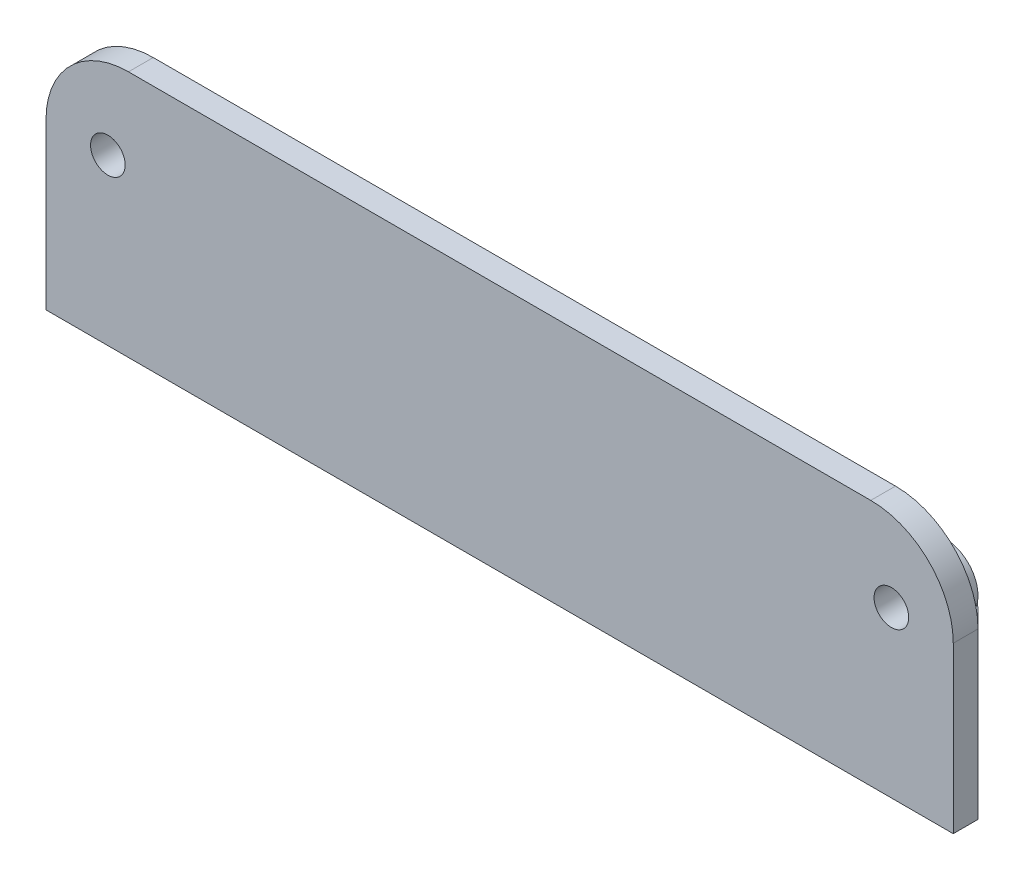
ISO-10303-21;
HEADER;
FILE_DESCRIPTION(('STEP AP214'),'2;1');
FILE_NAME('part.step','',(''),(''),'','','');
FILE_SCHEMA(('AUTOMOTIVE_DESIGN { 1 0 10303 214 1 1 1 1 }'));
ENDSEC;
DATA;
#1=APPLICATION_CONTEXT('core data for automotive mechanical design processes');
#2=APPLICATION_PROTOCOL_DEFINITION('international standard','automotive_design',2000,#1);
#3=PRODUCT_CONTEXT('',#1,'mechanical');
#4=PRODUCT('Part','Part','',(#3));
#5=PRODUCT_RELATED_PRODUCT_CATEGORY('part','',(#4));
#6=PRODUCT_DEFINITION_FORMATION('','',#4);
#7=PRODUCT_DEFINITION_CONTEXT('part definition',#1,'design');
#8=PRODUCT_DEFINITION('design','',#6,#7);
#9=PRODUCT_DEFINITION_SHAPE('','',#8);
#10=(LENGTH_UNIT() NAMED_UNIT(*) SI_UNIT(.MILLI.,.METRE.));
#11=(NAMED_UNIT(*) PLANE_ANGLE_UNIT() SI_UNIT($,.RADIAN.));
#12=(NAMED_UNIT(*) SI_UNIT($,.STERADIAN.) SOLID_ANGLE_UNIT());
#13=UNCERTAINTY_MEASURE_WITH_UNIT(LENGTH_MEASURE(1.E-05),#10,'distance_accuracy_value','');
#14=(GEOMETRIC_REPRESENTATION_CONTEXT(3) GLOBAL_UNCERTAINTY_ASSIGNED_CONTEXT((#13)) GLOBAL_UNIT_ASSIGNED_CONTEXT((#10,
#11,#12)) REPRESENTATION_CONTEXT('',''));
#15=CARTESIAN_POINT('',(0.,0.,0.));
#16=DIRECTION('',(0.,0.,1.));
#17=DIRECTION('',(1.,0.,0.));
#18=AXIS2_PLACEMENT_3D('',#15,#16,#17);
#19=CARTESIAN_POINT('',(0.,0.,15.));
#20=DIRECTION('',(0.,0.,-1.));
#21=DIRECTION('',(-1.,0.,0.));
#22=AXIS2_PLACEMENT_3D('',#19,#20,#21);
#23=PLANE('',#22);
#24=DIRECTION('',(-1.,0.,0.));
#25=VECTOR('',#24,1.);
#26=CARTESIAN_POINT('',(-55.,30.,15.));
#27=LINE('',#26,#25);
#28=CARTESIAN_POINT('',(-38.,30.,15.));
#29=VERTEX_POINT('',#28);
#30=CARTESIAN_POINT('',(-45.,30.,15.));
#31=VERTEX_POINT('',#30);
#32=EDGE_CURVE('E273',#29,#31,#27,.T.);
#33=ORIENTED_EDGE('',*,*,#32,.F.);
#34=DIRECTION('',(0.,-1.,0.));
#35=VECTOR('',#34,1.);
#36=CARTESIAN_POINT('',(-38.,5.,15.));
#37=LINE('',#36,#35);
#38=CARTESIAN_POINT('',(-38.,5.,15.));
#39=VERTEX_POINT('',#38);
#40=EDGE_CURVE('E399',#29,#39,#37,.T.);
#41=ORIENTED_EDGE('',*,*,#40,.T.);
#42=DIRECTION('',(1.,0.,0.));
#43=VECTOR('',#42,1.);
#44=CARTESIAN_POINT('',(55.,5.,15.));
#45=LINE('',#44,#43);
#46=CARTESIAN_POINT('',(-55.,5.,15.));
#47=VERTEX_POINT('',#46);
#48=EDGE_CURVE('E281',#47,#39,#45,.T.);
#49=ORIENTED_EDGE('',*,*,#48,.F.);
#50=DIRECTION('',(0.,-1.,0.));
#51=VECTOR('',#50,1.);
#52=CARTESIAN_POINT('',(-55.,0.,15.));
#53=LINE('',#52,#51);
#54=CARTESIAN_POINT('',(-55.,20.,15.));
#55=VERTEX_POINT('',#54);
#56=EDGE_CURVE('E253',#55,#47,#53,.T.);
#57=ORIENTED_EDGE('',*,*,#56,.F.);
#58=CARTESIAN_POINT('',(-45.,20.,15.));
#59=DIRECTION('',(0.,0.,-1.));
#60=DIRECTION('',(-1.,0.,0.));
#61=AXIS2_PLACEMENT_3D('',#58,#59,#60);
#62=CIRCLE('',#61,10.);
#63=EDGE_CURVE('E294',#55,#31,#62,.T.);
#64=ORIENTED_EDGE('',*,*,#63,.T.);
#65=EDGE_LOOP('',(#33,#41,#49,#57,#64));
#66=FACE_BOUND('',#65,.T.);
#67=CARTESIAN_POINT('',(-47.5,20.,15.));
#68=DIRECTION('',(0.,0.,-1.));
#69=DIRECTION('',(1.,0.,0.));
#70=AXIS2_PLACEMENT_3D('',#67,#68,#69);
#71=CIRCLE('',#70,4.00000000000001);
#72=CARTESIAN_POINT('',(-43.5,20.,15.));
#73=VERTEX_POINT('',#72);
#74=EDGE_CURVE('E456',#73,#73,#71,.T.);
#75=ORIENTED_EDGE('',*,*,#74,.F.);
#76=EDGE_LOOP('',(#75));
#77=FACE_BOUND('',#76,.T.);
#78=ADVANCED_FACE('F35',(#66,#77),#23,.T.);
#79=DIRECTION('',(0.,-1.,0.));
#80=VECTOR('',#79,1.);
#81=CARTESIAN_POINT('',(38.,5.,15.));
#82=LINE('',#81,#80);
#83=CARTESIAN_POINT('',(38.,30.,15.));
#84=VERTEX_POINT('',#83);
#85=CARTESIAN_POINT('',(38.,5.,15.));
#86=VERTEX_POINT('',#85);
#87=EDGE_CURVE('E245',#84,#86,#82,.T.);
#88=ORIENTED_EDGE('',*,*,#87,.F.);
#89=CARTESIAN_POINT('',(45.,30.,15.));
#90=VERTEX_POINT('',#89);
#91=EDGE_CURVE('E258',#90,#84,#27,.T.);
#92=ORIENTED_EDGE('',*,*,#91,.F.);
#93=CARTESIAN_POINT('',(45.,20.,15.));
#94=DIRECTION('',(0.,0.,-1.));
#95=DIRECTION('',(-1.,0.,0.));
#96=AXIS2_PLACEMENT_3D('',#93,#94,#95);
#97=CIRCLE('',#96,10.);
#98=CARTESIAN_POINT('',(55.,20.,15.));
#99=VERTEX_POINT('',#98);
#100=EDGE_CURVE('E292',#90,#99,#97,.T.);
#101=ORIENTED_EDGE('',*,*,#100,.T.);
#102=DIRECTION('',(0.,1.,0.));
#103=VECTOR('',#102,1.);
#104=CARTESIAN_POINT('',(55.,0.,15.));
#105=LINE('',#104,#103);
#106=CARTESIAN_POINT('',(55.,5.,15.));
#107=VERTEX_POINT('',#106);
#108=EDGE_CURVE('E270',#107,#99,#105,.T.);
#109=ORIENTED_EDGE('',*,*,#108,.F.);
#110=EDGE_CURVE('E285',#86,#107,#45,.T.);
#111=ORIENTED_EDGE('',*,*,#110,.F.);
#112=EDGE_LOOP('',(#88,#92,#101,#109,#111));
#113=FACE_BOUND('',#112,.T.);
#114=CARTESIAN_POINT('',(47.5,20.,15.));
#115=DIRECTION('',(0.,0.,-1.));
#116=DIRECTION('',(-1.,0.,0.));
#117=AXIS2_PLACEMENT_3D('',#114,#115,#116);
#118=CIRCLE('',#117,4.00000000000001);
#119=CARTESIAN_POINT('',(43.5,20.,15.));
#120=VERTEX_POINT('',#119);
#121=EDGE_CURVE('E447',#120,#120,#118,.T.);
#122=ORIENTED_EDGE('',*,*,#121,.F.);
#123=EDGE_LOOP('',(#122));
#124=FACE_BOUND('',#123,.T.);
#125=ADVANCED_FACE('F473',(#113,#124),#23,.T.);
#126=CARTESIAN_POINT('',(-38.,30.,15.));
#127=DIRECTION('',(0.,0.514495755427527,-0.857492925712544));
#128=DIRECTION('',(0.,0.857492925712544,0.514495755427527));
#129=AXIS2_PLACEMENT_3D('',#126,#127,#128);
#130=PLANE('',#129);
#131=DIRECTION('',(1.,0.,0.));
#132=VECTOR('',#131,1.);
#133=CARTESIAN_POINT('',(-38.,30.,15.));
#134=LINE('',#133,#132);
#135=CARTESIAN_POINT('',(6.,30.,15.));
#136=VERTEX_POINT('',#135);
#137=CARTESIAN_POINT('',(14.,30.,15.));
#138=VERTEX_POINT('',#137);
#139=EDGE_CURVE('E219',#136,#138,#134,.T.);
#140=ORIENTED_EDGE('',*,*,#139,.T.);
#141=DIRECTION('',(0.,-0.857492925712544,-0.514495755427527));
#142=VECTOR('',#141,1.);
#143=CARTESIAN_POINT('',(14.,30.,15.));
#144=LINE('',#143,#142);
#145=CARTESIAN_POINT('',(14.,5.,0.));
#146=VERTEX_POINT('',#145);
#147=EDGE_CURVE('E190',#138,#146,#144,.T.);
#148=ORIENTED_EDGE('',*,*,#147,.T.);
#149=DIRECTION('',(1.,0.,0.));
#150=VECTOR('',#149,1.);
#151=CARTESIAN_POINT('',(-38.,5.,0.));
#152=LINE('',#151,#150);
#153=CARTESIAN_POINT('',(6.,5.,0.));
#154=VERTEX_POINT('',#153);
#155=EDGE_CURVE('E485',#154,#146,#152,.T.);
#156=ORIENTED_EDGE('',*,*,#155,.F.);
#157=DIRECTION('',(0.,0.857492925712544,0.514495755427527));
#158=VECTOR('',#157,1.);
#159=CARTESIAN_POINT('',(6.,30.,15.));
#160=LINE('',#159,#158);
#161=EDGE_CURVE('E226',#154,#136,#160,.T.);
#162=ORIENTED_EDGE('',*,*,#161,.T.);
#163=EDGE_LOOP('',(#140,#148,#156,#162));
#164=FACE_BOUND('',#163,.T.);
#165=ADVANCED_FACE('F224',(#164),#130,.T.);
#166=CARTESIAN_POINT('',(26.,5.,0.));
#167=VERTEX_POINT('',#166);
#168=CARTESIAN_POINT('',(38.,5.,0.));
#169=VERTEX_POINT('',#168);
#170=EDGE_CURVE('E241',#167,#169,#152,.T.);
#171=ORIENTED_EDGE('',*,*,#170,.F.);
#172=DIRECTION('',(0.,0.857492925712544,0.514495755427527));
#173=VECTOR('',#172,1.);
#174=CARTESIAN_POINT('',(26.,30.,15.));
#175=LINE('',#174,#173);
#176=CARTESIAN_POINT('',(26.,30.,15.));
#177=VERTEX_POINT('',#176);
#178=EDGE_CURVE('E201',#167,#177,#175,.T.);
#179=ORIENTED_EDGE('',*,*,#178,.T.);
#180=EDGE_CURVE('E220',#177,#84,#134,.T.);
#181=ORIENTED_EDGE('',*,*,#180,.T.);
#182=DIRECTION('',(0.,0.857492925712544,0.514495755427527));
#183=VECTOR('',#182,1.);
#184=CARTESIAN_POINT('',(38.,30.,15.));
#185=LINE('',#184,#183);
#186=EDGE_CURVE('E404',#169,#84,#185,.T.);
#187=ORIENTED_EDGE('',*,*,#186,.F.);
#188=EDGE_LOOP('',(#171,#179,#181,#187));
#189=FACE_BOUND('',#188,.T.);
#190=ADVANCED_FACE('F480',(#189),#130,.T.);
#191=CARTESIAN_POINT('',(-14.,30.,15.));
#192=VERTEX_POINT('',#191);
#193=CARTESIAN_POINT('',(-6.,30.,15.));
#194=VERTEX_POINT('',#193);
#195=EDGE_CURVE('E227',#192,#194,#134,.T.);
#196=ORIENTED_EDGE('',*,*,#195,.T.);
#197=DIRECTION('',(0.,-0.857492925712544,-0.514495755427527));
#198=VECTOR('',#197,1.);
#199=CARTESIAN_POINT('',(-6.,30.,15.));
#200=LINE('',#199,#198);
#201=CARTESIAN_POINT('',(-6.,5.,0.));
#202=VERTEX_POINT('',#201);
#203=EDGE_CURVE('E330',#194,#202,#200,.T.);
#204=ORIENTED_EDGE('',*,*,#203,.T.);
#205=CARTESIAN_POINT('',(-14.,5.,0.));
#206=VERTEX_POINT('',#205);
#207=EDGE_CURVE('E240',#206,#202,#152,.T.);
#208=ORIENTED_EDGE('',*,*,#207,.F.);
#209=DIRECTION('',(0.,0.857492925712544,0.514495755427527));
#210=VECTOR('',#209,1.);
#211=CARTESIAN_POINT('',(-14.,30.,15.));
#212=LINE('',#211,#210);
#213=EDGE_CURVE('E323',#206,#192,#212,.T.);
#214=ORIENTED_EDGE('',*,*,#213,.T.);
#215=EDGE_LOOP('',(#196,#204,#208,#214));
#216=FACE_BOUND('',#215,.T.);
#217=ADVANCED_FACE('F492',(#216),#130,.T.);
#218=CARTESIAN_POINT('',(-26.,30.,15.));
#219=VERTEX_POINT('',#218);
#220=EDGE_CURVE('E230',#29,#219,#134,.T.);
#221=ORIENTED_EDGE('',*,*,#220,.T.);
#222=DIRECTION('',(0.,-0.857492925712544,-0.514495755427527));
#223=VECTOR('',#222,1.);
#224=CARTESIAN_POINT('',(-26.,30.,15.));
#225=LINE('',#224,#223);
#226=CARTESIAN_POINT('',(-26.,5.,0.));
#227=VERTEX_POINT('',#226);
#228=EDGE_CURVE('E326',#219,#227,#225,.T.);
#229=ORIENTED_EDGE('',*,*,#228,.T.);
#230=CARTESIAN_POINT('',(-38.,5.,0.));
#231=VERTEX_POINT('',#230);
#232=EDGE_CURVE('E231',#231,#227,#152,.T.);
#233=ORIENTED_EDGE('',*,*,#232,.F.);
#234=DIRECTION('',(0.,0.857492925712544,0.514495755427527));
#235=VECTOR('',#234,1.);
#236=CARTESIAN_POINT('',(-38.,30.,15.));
#237=LINE('',#236,#235);
#238=EDGE_CURVE('E236',#231,#29,#237,.T.);
#239=ORIENTED_EDGE('',*,*,#238,.T.);
#240=EDGE_LOOP('',(#221,#229,#233,#239));
#241=FACE_BOUND('',#240,.T.);
#242=ADVANCED_FACE('F505',(#241),#130,.T.);
#243=CARTESIAN_POINT('',(0.,5.,0.));
#244=DIRECTION('',(0.,1.,0.));
#245=DIRECTION('',(0.,0.,1.));
#246=AXIS2_PLACEMENT_3D('',#243,#244,#245);
#247=PLANE('',#246);
#248=DIRECTION('',(1.,0.,0.));
#249=VECTOR('',#248,1.);
#250=CARTESIAN_POINT('',(57.284508289482,5.,-5.00000000000001));
#251=LINE('',#250,#249);
#252=CARTESIAN_POINT('',(-30.857864376269,5.,-5.));
#253=VERTEX_POINT('',#252);
#254=CARTESIAN_POINT('',(30.857864376269,5.,-5.00000000000001));
#255=VERTEX_POINT('',#254);
#256=EDGE_CURVE('E359',#253,#255,#251,.T.);
#257=ORIENTED_EDGE('',*,*,#256,.F.);
#258=CARTESIAN_POINT('',(-30.857864376269,5.,5.));
#259=DIRECTION('',(0.,1.,0.));
#260=DIRECTION('',(0.,0.,1.));
#261=AXIS2_PLACEMENT_3D('',#258,#259,#260);
#262=CIRCLE('',#261,10.);
#263=CARTESIAN_POINT('',(-37.9289321881345,5.,-2.07106781186548));
#264=VERTEX_POINT('',#263);
#265=EDGE_CURVE('E342',#253,#264,#262,.T.);
#266=ORIENTED_EDGE('',*,*,#265,.T.);
#267=DIRECTION('',(0.707106781186549,0.,-0.707106781186546));
#268=VECTOR('',#267,1.);
#269=CARTESIAN_POINT('',(-19.9999999999999,5.,-20.));
#270=LINE('',#269,#268);
#271=EDGE_CURVE('E318',#264,#47,#270,.F.);
#272=ORIENTED_EDGE('',*,*,#271,.T.);
#273=ORIENTED_EDGE('',*,*,#48,.T.);
#274=DIRECTION('',(0.,0.,-1.));
#275=VECTOR('',#274,1.);
#276=CARTESIAN_POINT('',(-38.,5.,0.));
#277=LINE('',#276,#275);
#278=EDGE_CURVE('E401',#39,#231,#277,.T.);
#279=ORIENTED_EDGE('',*,*,#278,.T.);
#280=ORIENTED_EDGE('',*,*,#232,.T.);
#281=DIRECTION('',(0.,0.,1.));
#282=VECTOR('',#281,1.);
#283=CARTESIAN_POINT('',(-26.,5.,0.));
#284=LINE('',#283,#282);
#285=CARTESIAN_POINT('',(-26.,5.,15.));
#286=VERTEX_POINT('',#285);
#287=EDGE_CURVE('E425',#227,#286,#284,.T.);
#288=ORIENTED_EDGE('',*,*,#287,.T.);
#289=DIRECTION('',(1.,0.,0.));
#290=VECTOR('',#289,1.);
#291=CARTESIAN_POINT('',(-14.,5.,15.));
#292=LINE('',#291,#290);
#293=CARTESIAN_POINT('',(-14.,5.,15.));
#294=VERTEX_POINT('',#293);
#295=EDGE_CURVE('E423',#286,#294,#292,.T.);
#296=ORIENTED_EDGE('',*,*,#295,.T.);
#297=DIRECTION('',(0.,0.,-1.));
#298=VECTOR('',#297,1.);
#299=CARTESIAN_POINT('',(-14.,5.,0.));
#300=LINE('',#299,#298);
#301=EDGE_CURVE('E421',#294,#206,#300,.T.);
#302=ORIENTED_EDGE('',*,*,#301,.T.);
#303=ORIENTED_EDGE('',*,*,#207,.T.);
#304=DIRECTION('',(0.,0.,1.));
#305=VECTOR('',#304,1.);
#306=CARTESIAN_POINT('',(-6.,5.,0.));
#307=LINE('',#306,#305);
#308=CARTESIAN_POINT('',(-6.,5.,15.));
#309=VERTEX_POINT('',#308);
#310=EDGE_CURVE('E416',#202,#309,#307,.T.);
#311=ORIENTED_EDGE('',*,*,#310,.T.);
#312=DIRECTION('',(1.,0.,0.));
#313=VECTOR('',#312,1.);
#314=CARTESIAN_POINT('',(-6.,5.,15.));
#315=LINE('',#314,#313);
#316=CARTESIAN_POINT('',(6.,5.,15.));
#317=VERTEX_POINT('',#316);
#318=EDGE_CURVE('E438',#309,#317,#315,.T.);
#319=ORIENTED_EDGE('',*,*,#318,.T.);
#320=DIRECTION('',(0.,0.,-1.));
#321=VECTOR('',#320,1.);
#322=CARTESIAN_POINT('',(6.,5.,0.));
#323=LINE('',#322,#321);
#324=EDGE_CURVE('E436',#317,#154,#323,.T.);
#325=ORIENTED_EDGE('',*,*,#324,.T.);
#326=ORIENTED_EDGE('',*,*,#155,.T.);
#327=DIRECTION('',(0.,0.,1.));
#328=VECTOR('',#327,1.);
#329=CARTESIAN_POINT('',(14.,5.,0.));
#330=LINE('',#329,#328);
#331=CARTESIAN_POINT('',(14.,5.,15.));
#332=VERTEX_POINT('',#331);
#333=EDGE_CURVE('E195',#146,#332,#330,.T.);
#334=ORIENTED_EDGE('',*,*,#333,.T.);
#335=DIRECTION('',(1.,0.,0.));
#336=VECTOR('',#335,1.);
#337=CARTESIAN_POINT('',(14.,5.,15.));
#338=LINE('',#337,#336);
#339=CARTESIAN_POINT('',(26.,5.,15.));
#340=VERTEX_POINT('',#339);
#341=EDGE_CURVE('E209',#332,#340,#338,.T.);
#342=ORIENTED_EDGE('',*,*,#341,.T.);
#343=DIRECTION('',(0.,0.,-1.));
#344=VECTOR('',#343,1.);
#345=CARTESIAN_POINT('',(26.,5.,0.));
#346=LINE('',#345,#344);
#347=EDGE_CURVE('E221',#340,#167,#346,.T.);
#348=ORIENTED_EDGE('',*,*,#347,.T.);
#349=ORIENTED_EDGE('',*,*,#170,.T.);
#350=DIRECTION('',(0.,0.,-1.));
#351=VECTOR('',#350,1.);
#352=CARTESIAN_POINT('',(38.,5.,0.));
#353=LINE('',#352,#351);
#354=EDGE_CURVE('E409',#86,#169,#353,.T.);
#355=ORIENTED_EDGE('',*,*,#354,.F.);
#356=ORIENTED_EDGE('',*,*,#110,.T.);
#357=DIRECTION('',(0.707106781186548,0.,0.707106781186547));
#358=VECTOR('',#357,1.);
#359=CARTESIAN_POINT('',(20.,5.,-20.));
#360=LINE('',#359,#358);
#361=CARTESIAN_POINT('',(37.9289321881345,5.,-2.07106781186548));
#362=VERTEX_POINT('',#361);
#363=EDGE_CURVE('E315',#107,#362,#360,.F.);
#364=ORIENTED_EDGE('',*,*,#363,.T.);
#365=CARTESIAN_POINT('',(30.857864376269,5.,4.99999999999999));
#366=DIRECTION('',(0.,1.,0.));
#367=DIRECTION('',(0.,0.,1.));
#368=AXIS2_PLACEMENT_3D('',#365,#366,#367);
#369=CIRCLE('',#368,10.);
#370=EDGE_CURVE('E340',#362,#255,#369,.T.);
#371=ORIENTED_EDGE('',*,*,#370,.T.);
#372=EDGE_LOOP('',(#257,#266,#272,#273,#279,#280,#288,#296,#302,#303,#311,#319,#325,#326,#334,
#342,#348,#349,#355,#356,#364,#371));
#373=FACE_BOUND('',#372,.T.);
#374=CARTESIAN_POINT('',(-20.,5.,6.));
#375=DIRECTION('',(0.,-1.,0.));
#376=DIRECTION('',(0.,0.,-1.));
#377=AXIS2_PLACEMENT_3D('',#374,#375,#376);
#378=CIRCLE('',#377,2.25);
#379=CARTESIAN_POINT('',(-20.,5.,3.75));
#380=VERTEX_POINT('',#379);
#381=EDGE_CURVE('E210',#380,#380,#378,.T.);
#382=ORIENTED_EDGE('',*,*,#381,.T.);
#383=EDGE_LOOP('',(#382));
#384=FACE_BOUND('',#383,.T.);
#385=CARTESIAN_POINT('',(20.,5.,6.));
#386=DIRECTION('',(0.,-1.,0.));
#387=DIRECTION('',(0.,0.,-1.));
#388=AXIS2_PLACEMENT_3D('',#385,#386,#387);
#389=CIRCLE('',#388,2.25);
#390=CARTESIAN_POINT('',(20.,5.,3.75));
#391=VERTEX_POINT('',#390);
#392=EDGE_CURVE('E242',#391,#391,#389,.T.);
#393=ORIENTED_EDGE('',*,*,#392,.T.);
#394=EDGE_LOOP('',(#393));
#395=FACE_BOUND('',#394,.T.);
#396=ADVANCED_FACE('F363',(#373,#384,#395),#247,.T.);
#397=CARTESIAN_POINT('',(0.,0.,0.));
#398=DIRECTION('',(0.,1.,0.));
#399=DIRECTION('',(0.,0.,1.));
#400=AXIS2_PLACEMENT_3D('',#397,#398,#399);
#401=PLANE('',#400);
#402=DIRECTION('',(-0.707106781186549,0.,0.707106781186546));
#403=VECTOR('',#402,1.);
#404=CARTESIAN_POINT('',(-55.,0.,15.));
#405=LINE('',#404,#403);
#406=CARTESIAN_POINT('',(-55.,0.,15.));
#407=VERTEX_POINT('',#406);
#408=CARTESIAN_POINT('',(-37.9289321881345,0.,-2.07106781186548));
#409=VERTEX_POINT('',#408);
#410=EDGE_CURVE('E313',#407,#409,#405,.F.);
#411=ORIENTED_EDGE('',*,*,#410,.T.);
#412=CARTESIAN_POINT('',(-30.857864376269,0.,5.));
#413=DIRECTION('',(0.,1.,0.));
#414=DIRECTION('',(0.,0.,1.));
#415=AXIS2_PLACEMENT_3D('',#412,#413,#414);
#416=CIRCLE('',#415,10.);
#417=CARTESIAN_POINT('',(-30.857864376269,0.,-5.));
#418=VERTEX_POINT('',#417);
#419=EDGE_CURVE('E43',#409,#418,#416,.F.);
#420=ORIENTED_EDGE('',*,*,#419,.T.);
#421=DIRECTION('',(1.,0.,0.));
#422=VECTOR('',#421,1.);
#423=CARTESIAN_POINT('',(57.284508289482,0.,-5.00000000000001));
#424=LINE('',#423,#422);
#425=CARTESIAN_POINT('',(30.857864376269,0.,-5.00000000000001));
#426=VERTEX_POINT('',#425);
#427=EDGE_CURVE('E349',#418,#426,#424,.T.);
#428=ORIENTED_EDGE('',*,*,#427,.T.);
#429=CARTESIAN_POINT('',(30.857864376269,0.,4.99999999999999));
#430=DIRECTION('',(0.,1.,0.));
#431=DIRECTION('',(0.,0.,1.));
#432=AXIS2_PLACEMENT_3D('',#429,#430,#431);
#433=CIRCLE('',#432,10.);
#434=CARTESIAN_POINT('',(37.9289321881345,0.,-2.07106781186548));
#435=VERTEX_POINT('',#434);
#436=EDGE_CURVE('E50',#426,#435,#433,.F.);
#437=ORIENTED_EDGE('',*,*,#436,.T.);
#438=DIRECTION('',(-0.707106781186548,0.,-0.707106781186547));
#439=VECTOR('',#438,1.);
#440=CARTESIAN_POINT('',(25.,0.,-15.));
#441=LINE('',#440,#439);
#442=CARTESIAN_POINT('',(55.,0.,15.));
#443=VERTEX_POINT('',#442);
#444=EDGE_CURVE('E311',#435,#443,#441,.F.);
#445=ORIENTED_EDGE('',*,*,#444,.T.);
#446=DIRECTION('',(0.,0.,-1.));
#447=VECTOR('',#446,1.);
#448=CARTESIAN_POINT('',(55.,0.,15.));
#449=LINE('',#448,#447);
#450=CARTESIAN_POINT('',(55.,0.,18.));
#451=VERTEX_POINT('',#450);
#452=EDGE_CURVE('E287',#451,#443,#449,.T.);
#453=ORIENTED_EDGE('',*,*,#452,.F.);
#454=DIRECTION('',(1.,0.,0.));
#455=VECTOR('',#454,1.);
#456=CARTESIAN_POINT('',(-55.,0.,18.));
#457=LINE('',#456,#455);
#458=CARTESIAN_POINT('',(-55.,0.,18.));
#459=VERTEX_POINT('',#458);
#460=EDGE_CURVE('E257',#459,#451,#457,.T.);
#461=ORIENTED_EDGE('',*,*,#460,.F.);
#462=DIRECTION('',(0.,0.,1.));
#463=VECTOR('',#462,1.);
#464=CARTESIAN_POINT('',(-55.,0.,15.));
#465=LINE('',#464,#463);
#466=EDGE_CURVE('E280',#407,#459,#465,.T.);
#467=ORIENTED_EDGE('',*,*,#466,.F.);
#468=EDGE_LOOP('',(#411,#420,#428,#437,#445,#453,#461,#467));
#469=FACE_BOUND('',#468,.T.);
#470=CARTESIAN_POINT('',(-20.,0.,6.));
#471=DIRECTION('',(0.,1.,0.));
#472=DIRECTION('',(0.,0.,1.));
#473=AXIS2_PLACEMENT_3D('',#470,#471,#472);
#474=CIRCLE('',#473,2.25);
#475=CARTESIAN_POINT('',(-20.,0.,8.25000000000001));
#476=VERTEX_POINT('',#475);
#477=EDGE_CURVE('E277',#476,#476,#474,.T.);
#478=ORIENTED_EDGE('',*,*,#477,.T.);
#479=EDGE_LOOP('',(#478));
#480=FACE_BOUND('',#479,.T.);
#481=CARTESIAN_POINT('',(20.,0.,6.));
#482=DIRECTION('',(0.,1.,0.));
#483=DIRECTION('',(0.,0.,-1.));
#484=AXIS2_PLACEMENT_3D('',#481,#482,#483);
#485=CIRCLE('',#484,2.25);
#486=CARTESIAN_POINT('',(20.,0.,3.75));
#487=VERTEX_POINT('',#486);
#488=EDGE_CURVE('E267',#487,#487,#485,.T.);
#489=ORIENTED_EDGE('',*,*,#488,.T.);
#490=EDGE_LOOP('',(#489));
#491=FACE_BOUND('',#490,.T.);
#492=ADVANCED_FACE('F347',(#469,#480,#491),#401,.F.);
#493=CARTESIAN_POINT('',(-55.,5.,15.));
#494=DIRECTION('',(1.,0.,0.));
#495=DIRECTION('',(0.,0.,-1.));
#496=AXIS2_PLACEMENT_3D('',#493,#494,#495);
#497=PLANE('',#496);
#498=ORIENTED_EDGE('',*,*,#56,.T.);
#499=DIRECTION('',(0.,-1.,0.));
#500=VECTOR('',#499,1.);
#501=CARTESIAN_POINT('',(-55.,5.,15.));
#502=LINE('',#501,#500);
#503=EDGE_CURVE('E308',#47,#407,#502,.T.);
#504=ORIENTED_EDGE('',*,*,#503,.T.);
#505=ORIENTED_EDGE('',*,*,#466,.T.);
#506=DIRECTION('',(0.,-1.,0.));
#507=VECTOR('',#506,1.);
#508=CARTESIAN_POINT('',(-55.,0.,18.));
#509=LINE('',#508,#507);
#510=CARTESIAN_POINT('',(-55.,20.,18.));
#511=VERTEX_POINT('',#510);
#512=EDGE_CURVE('E254',#511,#459,#509,.T.);
#513=ORIENTED_EDGE('',*,*,#512,.F.);
#514=DIRECTION('',(0.,0.,-1.));
#515=VECTOR('',#514,1.);
#516=CARTESIAN_POINT('',(-55.,20.,15.));
#517=LINE('',#516,#515);
#518=EDGE_CURVE('E284',#511,#55,#517,.T.);
#519=ORIENTED_EDGE('',*,*,#518,.T.);
#520=EDGE_LOOP('',(#498,#504,#505,#513,#519));
#521=FACE_BOUND('',#520,.T.);
#522=ADVANCED_FACE('F368',(#521),#497,.F.);
#523=CARTESIAN_POINT('',(55.,5.,15.));
#524=DIRECTION('',(-1.,0.,0.));
#525=DIRECTION('',(0.,0.,1.));
#526=AXIS2_PLACEMENT_3D('',#523,#524,#525);
#527=PLANE('',#526);
#528=ORIENTED_EDGE('',*,*,#452,.T.);
#529=DIRECTION('',(0.,1.,0.));
#530=VECTOR('',#529,1.);
#531=CARTESIAN_POINT('',(55.,5.,15.));
#532=LINE('',#531,#530);
#533=EDGE_CURVE('E320',#443,#107,#532,.T.);
#534=ORIENTED_EDGE('',*,*,#533,.T.);
#535=ORIENTED_EDGE('',*,*,#108,.T.);
#536=DIRECTION('',(0.,0.,-1.));
#537=VECTOR('',#536,1.);
#538=CARTESIAN_POINT('',(55.,20.,15.));
#539=LINE('',#538,#537);
#540=CARTESIAN_POINT('',(55.,20.,18.));
#541=VERTEX_POINT('',#540);
#542=EDGE_CURVE('E306',#99,#541,#539,.F.);
#543=ORIENTED_EDGE('',*,*,#542,.T.);
#544=DIRECTION('',(0.,1.,0.));
#545=VECTOR('',#544,1.);
#546=CARTESIAN_POINT('',(55.,0.,18.));
#547=LINE('',#546,#545);
#548=EDGE_CURVE('E261',#451,#541,#547,.T.);
#549=ORIENTED_EDGE('',*,*,#548,.F.);
#550=EDGE_LOOP('',(#528,#534,#535,#543,#549));
#551=FACE_BOUND('',#550,.T.);
#552=ADVANCED_FACE('F379',(#551),#527,.F.);
#553=CARTESIAN_POINT('',(-20.,5.,6.));
#554=DIRECTION('',(0.,-1.,0.));
#555=DIRECTION('',(0.,0.,-1.));
#556=AXIS2_PLACEMENT_3D('',#553,#554,#555);
#557=CYLINDRICAL_SURFACE('',#556,2.25);
#558=ORIENTED_EDGE('',*,*,#381,.F.);
#559=EDGE_LOOP('',(#558));
#560=FACE_BOUND('',#559,.T.);
#561=ORIENTED_EDGE('',*,*,#477,.F.);
#562=EDGE_LOOP('',(#561));
#563=FACE_BOUND('',#562,.T.);
#564=ADVANCED_FACE('F533',(#560,#563),#557,.F.);
#565=CARTESIAN_POINT('',(20.,5.,6.));
#566=DIRECTION('',(0.,-1.,0.));
#567=DIRECTION('',(0.,0.,-1.));
#568=AXIS2_PLACEMENT_3D('',#565,#566,#567);
#569=CYLINDRICAL_SURFACE('',#568,2.25);
#570=ORIENTED_EDGE('',*,*,#392,.F.);
#571=EDGE_LOOP('',(#570));
#572=FACE_BOUND('',#571,.T.);
#573=ORIENTED_EDGE('',*,*,#488,.F.);
#574=EDGE_LOOP('',(#573));
#575=FACE_BOUND('',#574,.T.);
#576=ADVANCED_FACE('F530',(#572,#575),#569,.F.);
#577=CARTESIAN_POINT('',(0.,0.,18.));
#578=DIRECTION('',(0.,0.,-1.));
#579=DIRECTION('',(-1.,0.,0.));
#580=AXIS2_PLACEMENT_3D('',#577,#578,#579);
#581=PLANE('',#580);
#582=DIRECTION('',(-1.,0.,0.));
#583=VECTOR('',#582,1.);
#584=CARTESIAN_POINT('',(-55.,30.,18.));
#585=LINE('',#584,#583);
#586=CARTESIAN_POINT('',(45.,30.,18.));
#587=VERTEX_POINT('',#586);
#588=CARTESIAN_POINT('',(-45.,30.,18.));
#589=VERTEX_POINT('',#588);
#590=EDGE_CURVE('E264',#587,#589,#585,.T.);
#591=ORIENTED_EDGE('',*,*,#590,.T.);
#592=CARTESIAN_POINT('',(-45.,20.,18.));
#593=DIRECTION('',(0.,0.,-1.));
#594=DIRECTION('',(-1.,0.,0.));
#595=AXIS2_PLACEMENT_3D('',#592,#593,#594);
#596=CIRCLE('',#595,10.);
#597=EDGE_CURVE('E304',#589,#511,#596,.F.);
#598=ORIENTED_EDGE('',*,*,#597,.T.);
#599=ORIENTED_EDGE('',*,*,#512,.T.);
#600=ORIENTED_EDGE('',*,*,#460,.T.);
#601=ORIENTED_EDGE('',*,*,#548,.T.);
#602=CARTESIAN_POINT('',(45.,20.,18.));
#603=DIRECTION('',(0.,0.,-1.));
#604=DIRECTION('',(-1.,0.,0.));
#605=AXIS2_PLACEMENT_3D('',#602,#603,#604);
#606=CIRCLE('',#605,10.);
#607=EDGE_CURVE('E302',#541,#587,#606,.F.);
#608=ORIENTED_EDGE('',*,*,#607,.T.);
#609=EDGE_LOOP('',(#591,#598,#599,#600,#601,#608));
#610=FACE_BOUND('',#609,.T.);
#611=CARTESIAN_POINT('',(-47.5,20.,18.));
#612=DIRECTION('',(0.,0.,1.));
#613=DIRECTION('',(1.,0.,0.));
#614=AXIS2_PLACEMENT_3D('',#611,#612,#613);
#615=CIRCLE('',#614,2.1);
#616=CARTESIAN_POINT('',(-45.4,20.,18.));
#617=VERTEX_POINT('',#616);
#618=EDGE_CURVE('E250',#617,#617,#615,.T.);
#619=ORIENTED_EDGE('',*,*,#618,.F.);
#620=EDGE_LOOP('',(#619));
#621=FACE_BOUND('',#620,.T.);
#622=CARTESIAN_POINT('',(47.5,20.,18.));
#623=DIRECTION('',(0.,0.,1.));
#624=DIRECTION('',(-1.,0.,0.));
#625=AXIS2_PLACEMENT_3D('',#622,#623,#624);
#626=CIRCLE('',#625,2.1);
#627=CARTESIAN_POINT('',(45.4,20.,18.));
#628=VERTEX_POINT('',#627);
#629=EDGE_CURVE('E235',#628,#628,#626,.T.);
#630=ORIENTED_EDGE('',*,*,#629,.F.);
#631=EDGE_LOOP('',(#630));
#632=FACE_BOUND('',#631,.T.);
#633=ADVANCED_FACE('F375',(#610,#621,#632),#581,.F.);
#634=CARTESIAN_POINT('',(-55.,30.,18.));
#635=DIRECTION('',(0.,-1.,0.));
#636=DIRECTION('',(0.,0.,-1.));
#637=AXIS2_PLACEMENT_3D('',#634,#635,#636);
#638=PLANE('',#637);
#639=ORIENTED_EDGE('',*,*,#91,.T.);
#640=ORIENTED_EDGE('',*,*,#180,.F.);
#641=DIRECTION('',(1.,0.,0.));
#642=VECTOR('',#641,1.);
#643=CARTESIAN_POINT('',(14.,30.,15.));
#644=LINE('',#643,#642);
#645=EDGE_CURVE('E207',#138,#177,#644,.T.);
#646=ORIENTED_EDGE('',*,*,#645,.F.);
#647=ORIENTED_EDGE('',*,*,#139,.F.);
#648=DIRECTION('',(1.,0.,0.));
#649=VECTOR('',#648,1.);
#650=CARTESIAN_POINT('',(-6.,30.,15.));
#651=LINE('',#650,#649);
#652=EDGE_CURVE('E435',#194,#136,#651,.T.);
#653=ORIENTED_EDGE('',*,*,#652,.F.);
#654=ORIENTED_EDGE('',*,*,#195,.F.);
#655=DIRECTION('',(1.,0.,0.));
#656=VECTOR('',#655,1.);
#657=CARTESIAN_POINT('',(-14.,30.,15.));
#658=LINE('',#657,#656);
#659=EDGE_CURVE('E420',#219,#192,#658,.T.);
#660=ORIENTED_EDGE('',*,*,#659,.F.);
#661=ORIENTED_EDGE('',*,*,#220,.F.);
#662=ORIENTED_EDGE('',*,*,#32,.T.);
#663=DIRECTION('',(0.,0.,-1.));
#664=VECTOR('',#663,1.);
#665=CARTESIAN_POINT('',(-45.,30.,18.));
#666=LINE('',#665,#664);
#667=EDGE_CURVE('E300',#31,#589,#666,.F.);
#668=ORIENTED_EDGE('',*,*,#667,.T.);
#669=ORIENTED_EDGE('',*,*,#590,.F.);
#670=DIRECTION('',(0.,0.,-1.));
#671=VECTOR('',#670,1.);
#672=CARTESIAN_POINT('',(45.,30.,18.));
#673=LINE('',#672,#671);
#674=EDGE_CURVE('E297',#587,#90,#673,.T.);
#675=ORIENTED_EDGE('',*,*,#674,.T.);
#676=EDGE_LOOP('',(#639,#640,#646,#647,#653,#654,#660,#661,#662,#668,#669,#675));
#677=FACE_BOUND('',#676,.T.);
#678=ADVANCED_FACE('F217',(#677),#638,.F.);
#679=CARTESIAN_POINT('',(-47.5,20.,18.));
#680=DIRECTION('',(0.,0.,-1.));
#681=DIRECTION('',(-1.,0.,0.));
#682=AXIS2_PLACEMENT_3D('',#679,#680,#681);
#683=CYLINDRICAL_SURFACE('',#682,2.1);
#684=ORIENTED_EDGE('',*,*,#618,.T.);
#685=EDGE_LOOP('',(#684));
#686=FACE_BOUND('',#685,.T.);
#687=CARTESIAN_POINT('',(-47.5,20.,11.5));
#688=DIRECTION('',(0.,0.,-1.));
#689=DIRECTION('',(1.,0.,0.));
#690=AXIS2_PLACEMENT_3D('',#687,#688,#689);
#691=CIRCLE('',#690,2.1);
#692=CARTESIAN_POINT('',(-45.4,20.,11.5));
#693=VERTEX_POINT('',#692);
#694=EDGE_CURVE('E358',#693,#693,#691,.T.);
#695=ORIENTED_EDGE('',*,*,#694,.T.);
#696=EDGE_LOOP('',(#695));
#697=FACE_BOUND('',#696,.T.);
#698=ADVANCED_FACE('F529',(#686,#697),#683,.F.);
#699=CARTESIAN_POINT('',(47.5,20.,18.));
#700=DIRECTION('',(0.,0.,-1.));
#701=DIRECTION('',(-1.,0.,0.));
#702=AXIS2_PLACEMENT_3D('',#699,#700,#701);
#703=CYLINDRICAL_SURFACE('',#702,2.1);
#704=ORIENTED_EDGE('',*,*,#629,.T.);
#705=EDGE_LOOP('',(#704));
#706=FACE_BOUND('',#705,.T.);
#707=CARTESIAN_POINT('',(47.5,20.,11.5));
#708=DIRECTION('',(0.,0.,-1.));
#709=DIRECTION('',(-1.,0.,0.));
#710=AXIS2_PLACEMENT_3D('',#707,#708,#709);
#711=CIRCLE('',#710,2.1);
#712=CARTESIAN_POINT('',(45.4,20.,11.5));
#713=VERTEX_POINT('',#712);
#714=EDGE_CURVE('E450',#713,#713,#711,.T.);
#715=ORIENTED_EDGE('',*,*,#714,.T.);
#716=EDGE_LOOP('',(#715));
#717=FACE_BOUND('',#716,.T.);
#718=ADVANCED_FACE('F548',(#706,#717),#703,.F.);
#719=CARTESIAN_POINT('',(-45.,20.,15.));
#720=DIRECTION('',(0.,0.,-1.));
#721=DIRECTION('',(-1.,0.,0.));
#722=AXIS2_PLACEMENT_3D('',#719,#720,#721);
#723=CYLINDRICAL_SURFACE('',#722,10.);
#724=ORIENTED_EDGE('',*,*,#597,.F.);
#725=ORIENTED_EDGE('',*,*,#667,.F.);
#726=ORIENTED_EDGE('',*,*,#63,.F.);
#727=ORIENTED_EDGE('',*,*,#518,.F.);
#728=EDGE_LOOP('',(#724,#725,#726,#727));
#729=FACE_BOUND('',#728,.T.);
#730=ADVANCED_FACE('F393',(#729),#723,.T.);
#731=CARTESIAN_POINT('',(45.,20.,18.));
#732=DIRECTION('',(0.,0.,-1.));
#733=DIRECTION('',(-1.,0.,0.));
#734=AXIS2_PLACEMENT_3D('',#731,#732,#733);
#735=CYLINDRICAL_SURFACE('',#734,10.);
#736=ORIENTED_EDGE('',*,*,#607,.F.);
#737=ORIENTED_EDGE('',*,*,#542,.F.);
#738=ORIENTED_EDGE('',*,*,#100,.F.);
#739=ORIENTED_EDGE('',*,*,#674,.F.);
#740=EDGE_LOOP('',(#736,#737,#738,#739));
#741=FACE_BOUND('',#740,.T.);
#742=ADVANCED_FACE('F384',(#741),#735,.T.);
#743=CARTESIAN_POINT('',(-55.,5.,15.));
#744=DIRECTION('',(0.707106781186546,0.,0.707106781186549));
#745=DIRECTION('',(0.,-1.,0.));
#746=AXIS2_PLACEMENT_3D('',#743,#744,#745);
#747=PLANE('',#746);
#748=ORIENTED_EDGE('',*,*,#271,.F.);
#749=DIRECTION('',(0.,1.,0.));
#750=VECTOR('',#749,1.);
#751=CARTESIAN_POINT('',(-37.9289321881345,0.,-2.07106781186548));
#752=LINE('',#751,#750);
#753=EDGE_CURVE('E58',#264,#409,#752,.F.);
#754=ORIENTED_EDGE('',*,*,#753,.T.);
#755=ORIENTED_EDGE('',*,*,#410,.F.);
#756=ORIENTED_EDGE('',*,*,#503,.F.);
#757=EDGE_LOOP('',(#748,#754,#755,#756));
#758=FACE_BOUND('',#757,.T.);
#759=ADVANCED_FACE('F366',(#758),#747,.F.);
#760=CARTESIAN_POINT('',(25.,5.,-15.));
#761=DIRECTION('',(-0.707106781186547,0.,0.707106781186548));
#762=DIRECTION('',(0.,-1.,0.));
#763=AXIS2_PLACEMENT_3D('',#760,#761,#762);
#764=PLANE('',#763);
#765=ORIENTED_EDGE('',*,*,#444,.F.);
#766=DIRECTION('',(0.,-1.,0.));
#767=VECTOR('',#766,1.);
#768=CARTESIAN_POINT('',(37.9289321881345,5.,-2.07106781186548));
#769=LINE('',#768,#767);
#770=EDGE_CURVE('E11',#435,#362,#769,.F.);
#771=ORIENTED_EDGE('',*,*,#770,.T.);
#772=ORIENTED_EDGE('',*,*,#363,.F.);
#773=ORIENTED_EDGE('',*,*,#533,.F.);
#774=EDGE_LOOP('',(#765,#771,#772,#773));
#775=FACE_BOUND('',#774,.T.);
#776=ADVANCED_FACE('F468',(#775),#764,.F.);
#777=CARTESIAN_POINT('',(38.,0.,0.));
#778=DIRECTION('',(1.,0.,0.));
#779=DIRECTION('',(0.,0.,-1.));
#780=AXIS2_PLACEMENT_3D('',#777,#778,#779);
#781=PLANE('',#780);
#782=ORIENTED_EDGE('',*,*,#87,.T.);
#783=ORIENTED_EDGE('',*,*,#354,.T.);
#784=ORIENTED_EDGE('',*,*,#186,.T.);
#785=EDGE_LOOP('',(#782,#783,#784));
#786=FACE_BOUND('',#785,.T.);
#787=ADVANCED_FACE('F476',(#786),#781,.T.);
#788=CARTESIAN_POINT('',(-38.,0.,0.));
#789=DIRECTION('',(1.,0.,0.));
#790=DIRECTION('',(0.,0.,-1.));
#791=AXIS2_PLACEMENT_3D('',#788,#789,#790);
#792=PLANE('',#791);
#793=ORIENTED_EDGE('',*,*,#40,.F.);
#794=ORIENTED_EDGE('',*,*,#238,.F.);
#795=ORIENTED_EDGE('',*,*,#278,.F.);
#796=EDGE_LOOP('',(#793,#794,#795));
#797=FACE_BOUND('',#796,.T.);
#798=ADVANCED_FACE('F506',(#797),#792,.F.);
#799=CARTESIAN_POINT('',(-26.,30.,0.));
#800=DIRECTION('',(1.,0.,0.));
#801=DIRECTION('',(0.,0.,-1.));
#802=AXIS2_PLACEMENT_3D('',#799,#800,#801);
#803=PLANE('',#802);
#804=DIRECTION('',(0.,-1.,0.));
#805=VECTOR('',#804,1.);
#806=CARTESIAN_POINT('',(-26.,30.,15.));
#807=LINE('',#806,#805);
#808=EDGE_CURVE('E413',#219,#286,#807,.T.);
#809=ORIENTED_EDGE('',*,*,#808,.T.);
#810=ORIENTED_EDGE('',*,*,#287,.F.);
#811=ORIENTED_EDGE('',*,*,#228,.F.);
#812=EDGE_LOOP('',(#809,#810,#811));
#813=FACE_BOUND('',#812,.T.);
#814=ADVANCED_FACE('F508',(#813),#803,.T.);
#815=CARTESIAN_POINT('',(-14.,30.,15.));
#816=DIRECTION('',(0.,0.,-1.));
#817=DIRECTION('',(-1.,0.,0.));
#818=AXIS2_PLACEMENT_3D('',#815,#816,#817);
#819=PLANE('',#818);
#820=ORIENTED_EDGE('',*,*,#295,.F.);
#821=ORIENTED_EDGE('',*,*,#808,.F.);
#822=ORIENTED_EDGE('',*,*,#659,.T.);
#823=DIRECTION('',(0.,-1.,0.));
#824=VECTOR('',#823,1.);
#825=CARTESIAN_POINT('',(-14.,30.,15.));
#826=LINE('',#825,#824);
#827=EDGE_CURVE('E417',#192,#294,#826,.T.);
#828=ORIENTED_EDGE('',*,*,#827,.T.);
#829=EDGE_LOOP('',(#820,#821,#822,#828));
#830=FACE_BOUND('',#829,.T.);
#831=ADVANCED_FACE('F514',(#830),#819,.T.);
#832=CARTESIAN_POINT('',(-14.,30.,0.));
#833=DIRECTION('',(-1.,0.,0.));
#834=DIRECTION('',(0.,0.,1.));
#835=AXIS2_PLACEMENT_3D('',#832,#833,#834);
#836=PLANE('',#835);
#837=ORIENTED_EDGE('',*,*,#301,.F.);
#838=ORIENTED_EDGE('',*,*,#827,.F.);
#839=ORIENTED_EDGE('',*,*,#213,.F.);
#840=EDGE_LOOP('',(#837,#838,#839));
#841=FACE_BOUND('',#840,.T.);
#842=ADVANCED_FACE('F599',(#841),#836,.T.);
#843=CARTESIAN_POINT('',(-6.,30.,0.));
#844=DIRECTION('',(1.,0.,0.));
#845=DIRECTION('',(0.,0.,-1.));
#846=AXIS2_PLACEMENT_3D('',#843,#844,#845);
#847=PLANE('',#846);
#848=DIRECTION('',(0.,-1.,0.));
#849=VECTOR('',#848,1.);
#850=CARTESIAN_POINT('',(-6.,30.,15.));
#851=LINE('',#850,#849);
#852=EDGE_CURVE('E429',#194,#309,#851,.T.);
#853=ORIENTED_EDGE('',*,*,#852,.T.);
#854=ORIENTED_EDGE('',*,*,#310,.F.);
#855=ORIENTED_EDGE('',*,*,#203,.F.);
#856=EDGE_LOOP('',(#853,#854,#855));
#857=FACE_BOUND('',#856,.T.);
#858=ADVANCED_FACE('F496',(#857),#847,.T.);
#859=CARTESIAN_POINT('',(-6.,30.,15.));
#860=DIRECTION('',(0.,0.,-1.));
#861=DIRECTION('',(-1.,0.,0.));
#862=AXIS2_PLACEMENT_3D('',#859,#860,#861);
#863=PLANE('',#862);
#864=ORIENTED_EDGE('',*,*,#318,.F.);
#865=ORIENTED_EDGE('',*,*,#852,.F.);
#866=ORIENTED_EDGE('',*,*,#652,.T.);
#867=DIRECTION('',(0.,-1.,0.));
#868=VECTOR('',#867,1.);
#869=CARTESIAN_POINT('',(6.,30.,15.));
#870=LINE('',#869,#868);
#871=EDGE_CURVE('E432',#136,#317,#870,.T.);
#872=ORIENTED_EDGE('',*,*,#871,.T.);
#873=EDGE_LOOP('',(#864,#865,#866,#872));
#874=FACE_BOUND('',#873,.T.);
#875=ADVANCED_FACE('F498',(#874),#863,.T.);
#876=CARTESIAN_POINT('',(6.,30.,0.));
#877=DIRECTION('',(-1.,0.,0.));
#878=DIRECTION('',(0.,0.,1.));
#879=AXIS2_PLACEMENT_3D('',#876,#877,#878);
#880=PLANE('',#879);
#881=ORIENTED_EDGE('',*,*,#324,.F.);
#882=ORIENTED_EDGE('',*,*,#871,.F.);
#883=ORIENTED_EDGE('',*,*,#161,.F.);
#884=EDGE_LOOP('',(#881,#882,#883));
#885=FACE_BOUND('',#884,.T.);
#886=ADVANCED_FACE('F591',(#885),#880,.T.);
#887=CARTESIAN_POINT('',(14.,30.,0.));
#888=DIRECTION('',(1.,0.,0.));
#889=DIRECTION('',(0.,0.,-1.));
#890=AXIS2_PLACEMENT_3D('',#887,#888,#889);
#891=PLANE('',#890);
#892=DIRECTION('',(0.,-1.,0.));
#893=VECTOR('',#892,1.);
#894=CARTESIAN_POINT('',(14.,30.,15.));
#895=LINE('',#894,#893);
#896=EDGE_CURVE('E193',#138,#332,#895,.T.);
#897=ORIENTED_EDGE('',*,*,#896,.T.);
#898=ORIENTED_EDGE('',*,*,#333,.F.);
#899=ORIENTED_EDGE('',*,*,#147,.F.);
#900=EDGE_LOOP('',(#897,#898,#899));
#901=FACE_BOUND('',#900,.T.);
#902=ADVANCED_FACE('F192',(#901),#891,.T.);
#903=CARTESIAN_POINT('',(14.,30.,15.));
#904=DIRECTION('',(0.,0.,-1.));
#905=DIRECTION('',(-1.,0.,0.));
#906=AXIS2_PLACEMENT_3D('',#903,#904,#905);
#907=PLANE('',#906);
#908=ORIENTED_EDGE('',*,*,#341,.F.);
#909=ORIENTED_EDGE('',*,*,#896,.F.);
#910=ORIENTED_EDGE('',*,*,#645,.T.);
#911=DIRECTION('',(0.,-1.,0.));
#912=VECTOR('',#911,1.);
#913=CARTESIAN_POINT('',(26.,30.,15.));
#914=LINE('',#913,#912);
#915=EDGE_CURVE('E211',#177,#340,#914,.T.);
#916=ORIENTED_EDGE('',*,*,#915,.T.);
#917=EDGE_LOOP('',(#908,#909,#910,#916));
#918=FACE_BOUND('',#917,.T.);
#919=ADVANCED_FACE('F205',(#918),#907,.T.);
#920=CARTESIAN_POINT('',(26.,30.,0.));
#921=DIRECTION('',(-1.,0.,0.));
#922=DIRECTION('',(0.,0.,1.));
#923=AXIS2_PLACEMENT_3D('',#920,#921,#922);
#924=PLANE('',#923);
#925=ORIENTED_EDGE('',*,*,#347,.F.);
#926=ORIENTED_EDGE('',*,*,#915,.F.);
#927=ORIENTED_EDGE('',*,*,#178,.F.);
#928=EDGE_LOOP('',(#925,#926,#927));
#929=FACE_BOUND('',#928,.T.);
#930=ADVANCED_FACE('F484',(#929),#924,.T.);
#931=CARTESIAN_POINT('',(47.5,20.,11.5));
#932=DIRECTION('',(0.,0.,-1.));
#933=DIRECTION('',(-1.,0.,0.));
#934=AXIS2_PLACEMENT_3D('',#931,#932,#933);
#935=PLANE('',#934);
#936=CARTESIAN_POINT('',(47.5,20.,11.5));
#937=DIRECTION('',(0.,0.,-1.));
#938=DIRECTION('',(-1.,0.,0.));
#939=AXIS2_PLACEMENT_3D('',#936,#937,#938);
#940=CIRCLE('',#939,4.00000000000001);
#941=CARTESIAN_POINT('',(43.5,20.,11.5));
#942=VERTEX_POINT('',#941);
#943=EDGE_CURVE('E427',#942,#942,#940,.T.);
#944=ORIENTED_EDGE('',*,*,#943,.T.);
#945=EDGE_LOOP('',(#944));
#946=FACE_BOUND('',#945,.T.);
#947=ORIENTED_EDGE('',*,*,#714,.F.);
#948=EDGE_LOOP('',(#947));
#949=FACE_BOUND('',#948,.T.);
#950=ADVANCED_FACE('F578',(#946,#949),#935,.T.);
#951=CARTESIAN_POINT('',(47.5,20.,11.5));
#952=DIRECTION('',(0.,0.,1.));
#953=DIRECTION('',(1.,0.,0.));
#954=AXIS2_PLACEMENT_3D('',#951,#952,#953);
#955=CYLINDRICAL_SURFACE('',#954,4.00000000000001);
#956=ORIENTED_EDGE('',*,*,#943,.F.);
#957=EDGE_LOOP('',(#956));
#958=FACE_BOUND('',#957,.T.);
#959=ORIENTED_EDGE('',*,*,#121,.T.);
#960=EDGE_LOOP('',(#959));
#961=FACE_BOUND('',#960,.T.);
#962=ADVANCED_FACE('F575',(#958,#961),#955,.T.);
#963=CARTESIAN_POINT('',(-47.5,20.,11.5));
#964=DIRECTION('',(0.,0.,1.));
#965=DIRECTION('',(1.,0.,0.));
#966=AXIS2_PLACEMENT_3D('',#963,#964,#965);
#967=PLANE('',#966);
#968=CARTESIAN_POINT('',(-47.5,20.,11.5));
#969=DIRECTION('',(0.,0.,-1.));
#970=DIRECTION('',(1.,0.,0.));
#971=AXIS2_PLACEMENT_3D('',#968,#969,#970);
#972=CIRCLE('',#971,4.00000000000001);
#973=CARTESIAN_POINT('',(-43.5,20.,11.5));
#974=VERTEX_POINT('',#973);
#975=EDGE_CURVE('E455',#974,#974,#972,.T.);
#976=ORIENTED_EDGE('',*,*,#975,.T.);
#977=EDGE_LOOP('',(#976));
#978=FACE_BOUND('',#977,.T.);
#979=ORIENTED_EDGE('',*,*,#694,.F.);
#980=EDGE_LOOP('',(#979));
#981=FACE_BOUND('',#980,.T.);
#982=ADVANCED_FACE('F570',(#978,#981),#967,.F.);
#983=CARTESIAN_POINT('',(-47.5,20.,11.5));
#984=DIRECTION('',(0.,0.,1.));
#985=DIRECTION('',(1.,0.,0.));
#986=AXIS2_PLACEMENT_3D('',#983,#984,#985);
#987=CYLINDRICAL_SURFACE('',#986,4.00000000000001);
#988=ORIENTED_EDGE('',*,*,#975,.F.);
#989=EDGE_LOOP('',(#988));
#990=FACE_BOUND('',#989,.T.);
#991=ORIENTED_EDGE('',*,*,#74,.T.);
#992=EDGE_LOOP('',(#991));
#993=FACE_BOUND('',#992,.T.);
#994=ADVANCED_FACE('F565',(#990,#993),#987,.T.);
#995=CARTESIAN_POINT('',(57.284508289482,0.,-5.00000000000001));
#996=DIRECTION('',(0.,0.,1.));
#997=DIRECTION('',(1.,0.,0.));
#998=AXIS2_PLACEMENT_3D('',#995,#996,#997);
#999=PLANE('',#998);
#1000=ORIENTED_EDGE('',*,*,#427,.F.);
#1001=DIRECTION('',(0.,-1.,0.));
#1002=VECTOR('',#1001,1.);
#1003=CARTESIAN_POINT('',(-30.857864376269,5.,-5.));
#1004=LINE('',#1003,#1002);
#1005=EDGE_CURVE('E337',#418,#253,#1004,.F.);
#1006=ORIENTED_EDGE('',*,*,#1005,.T.);
#1007=ORIENTED_EDGE('',*,*,#256,.T.);
#1008=DIRECTION('',(0.,1.,0.));
#1009=VECTOR('',#1008,1.);
#1010=CARTESIAN_POINT('',(30.857864376269,0.,-5.00000000000001));
#1011=LINE('',#1010,#1009);
#1012=EDGE_CURVE('E200',#255,#426,#1011,.F.);
#1013=ORIENTED_EDGE('',*,*,#1012,.T.);
#1014=EDGE_LOOP('',(#1000,#1006,#1007,#1013));
#1015=FACE_BOUND('',#1014,.T.);
#1016=ADVANCED_FACE('F354',(#1015),#999,.F.);
#1017=CARTESIAN_POINT('',(-30.857864376269,0.,5.));
#1018=DIRECTION('',(0.,1.,0.));
#1019=DIRECTION('',(0.,0.,1.));
#1020=AXIS2_PLACEMENT_3D('',#1017,#1018,#1019);
#1021=CYLINDRICAL_SURFACE('',#1020,10.);
#1022=ORIENTED_EDGE('',*,*,#419,.F.);
#1023=ORIENTED_EDGE('',*,*,#753,.F.);
#1024=ORIENTED_EDGE('',*,*,#265,.F.);
#1025=ORIENTED_EDGE('',*,*,#1005,.F.);
#1026=EDGE_LOOP('',(#1022,#1023,#1024,#1025));
#1027=FACE_BOUND('',#1026,.T.);
#1028=ADVANCED_FACE('F361',(#1027),#1021,.T.);
#1029=CARTESIAN_POINT('',(30.857864376269,0.,4.99999999999999));
#1030=DIRECTION('',(0.,-1.,0.));
#1031=DIRECTION('',(0.,0.,-1.));
#1032=AXIS2_PLACEMENT_3D('',#1029,#1030,#1031);
#1033=CYLINDRICAL_SURFACE('',#1032,10.);
#1034=ORIENTED_EDGE('',*,*,#370,.F.);
#1035=ORIENTED_EDGE('',*,*,#770,.F.);
#1036=ORIENTED_EDGE('',*,*,#436,.F.);
#1037=ORIENTED_EDGE('',*,*,#1012,.F.);
#1038=EDGE_LOOP('',(#1034,#1035,#1036,#1037));
#1039=FACE_BOUND('',#1038,.T.);
#1040=ADVANCED_FACE('F37',(#1039),#1033,.T.);
#1041=CLOSED_SHELL('',(#78,#125,#165,#190,#217,#242,#396,#492,#522,#552,#564,#576,#633,#678,
#698,#718,#730,#742,#759,#776,#787,#798,#814,#831,#842,#858,#875,#886,#902,#919,#930,#950,#962,
#982,#994,#1016,#1028,#1040));
#1042=MANIFOLD_SOLID_BREP('B2',#1041);
#1043=ADVANCED_BREP_SHAPE_REPRESENTATION('',(#18,#1042),#14);
#1044=SHAPE_DEFINITION_REPRESENTATION(#9,#1043);
ENDSEC;
END-ISO-10303-21;
